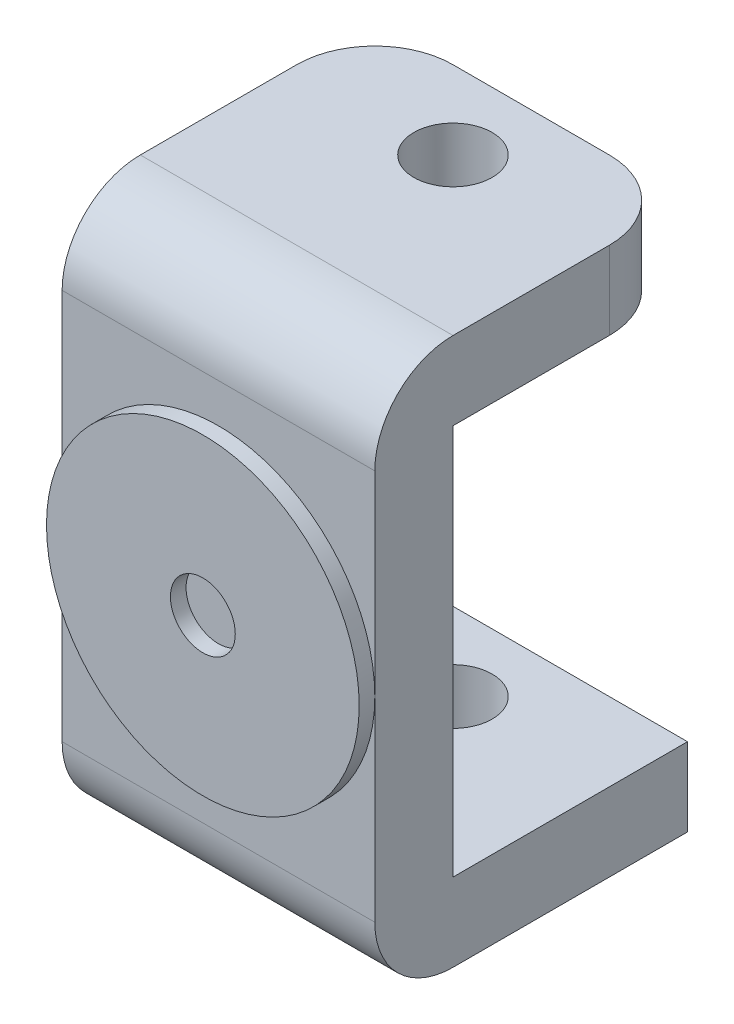
ISO-10303-21;
HEADER;
FILE_DESCRIPTION(('STEP AP214'),'2;1');
FILE_NAME('part.step','',(''),(''),'','','');
FILE_SCHEMA(('AUTOMOTIVE_DESIGN { 1 0 10303 214 1 1 1 1 }'));
ENDSEC;
DATA;
#1=APPLICATION_CONTEXT('core data for automotive mechanical design processes');
#2=APPLICATION_PROTOCOL_DEFINITION('international standard','automotive_design',2000,#1);
#3=PRODUCT_CONTEXT('',#1,'mechanical');
#4=PRODUCT('Part','Part','',(#3));
#5=PRODUCT_RELATED_PRODUCT_CATEGORY('part','',(#4));
#6=PRODUCT_DEFINITION_FORMATION('','',#4);
#7=PRODUCT_DEFINITION_CONTEXT('part definition',#1,'design');
#8=PRODUCT_DEFINITION('design','',#6,#7);
#9=PRODUCT_DEFINITION_SHAPE('','',#8);
#10=(LENGTH_UNIT() NAMED_UNIT(*) SI_UNIT(.MILLI.,.METRE.));
#11=(NAMED_UNIT(*) PLANE_ANGLE_UNIT() SI_UNIT($,.RADIAN.));
#12=(NAMED_UNIT(*) SI_UNIT($,.STERADIAN.) SOLID_ANGLE_UNIT());
#13=UNCERTAINTY_MEASURE_WITH_UNIT(LENGTH_MEASURE(1.E-05),#10,'distance_accuracy_value','');
#14=(GEOMETRIC_REPRESENTATION_CONTEXT(3) GLOBAL_UNCERTAINTY_ASSIGNED_CONTEXT((#13)) GLOBAL_UNIT_ASSIGNED_CONTEXT((#10,
#11,#12)) REPRESENTATION_CONTEXT('',''));
#15=CARTESIAN_POINT('',(0.,0.,0.));
#16=DIRECTION('',(0.,0.,1.));
#17=DIRECTION('',(1.,0.,0.));
#18=AXIS2_PLACEMENT_3D('',#15,#16,#17);
#19=CARTESIAN_POINT('',(0.,0.,1.));
#20=DIRECTION('',(0.,0.,1.));
#21=DIRECTION('',(1.,0.,0.));
#22=AXIS2_PLACEMENT_3D('',#19,#20,#21);
#23=PLANE('',#22);
#24=DIRECTION('',(0.,1.,0.));
#25=VECTOR('',#24,1.);
#26=CARTESIAN_POINT('',(2.,2.5,1.));
#27=LINE('',#26,#25);
#28=CARTESIAN_POINT('',(2.,-2.5,1.));
#29=VERTEX_POINT('',#28);
#30=CARTESIAN_POINT('',(2.,0.,1.));
#31=VERTEX_POINT('',#30);
#32=EDGE_CURVE('E147',#29,#31,#27,.T.);
#33=ORIENTED_EDGE('',*,*,#32,.T.);
#34=CARTESIAN_POINT('',(0.,0.,1.));
#35=DIRECTION('',(0.,0.,1.));
#36=DIRECTION('',(1.,0.,0.));
#37=AXIS2_PLACEMENT_3D('',#34,#35,#36);
#38=CIRCLE('',#37,2.);
#39=CARTESIAN_POINT('',(-2.,0.,1.));
#40=VERTEX_POINT('',#39);
#41=EDGE_CURVE('E11',#31,#40,#38,.F.);
#42=ORIENTED_EDGE('',*,*,#41,.T.);
#43=DIRECTION('',(0.,-1.,0.));
#44=VECTOR('',#43,1.);
#45=CARTESIAN_POINT('',(-2.,2.5,1.));
#46=LINE('',#45,#44);
#47=CARTESIAN_POINT('',(-2.,-2.5,1.));
#48=VERTEX_POINT('',#47);
#49=EDGE_CURVE('E144',#40,#48,#46,.T.);
#50=ORIENTED_EDGE('',*,*,#49,.T.);
#51=DIRECTION('',(-1.,0.,0.));
#52=VECTOR('',#51,1.);
#53=CARTESIAN_POINT('',(2.,-2.5,1.));
#54=LINE('',#53,#52);
#55=EDGE_CURVE('E196',#48,#29,#54,.F.);
#56=ORIENTED_EDGE('',*,*,#55,.T.);
#57=EDGE_LOOP('',(#33,#42,#50,#56));
#58=FACE_BOUND('',#57,.T.);
#59=ADVANCED_FACE('F39',(#58),#23,.T.);
#60=CARTESIAN_POINT('',(2.,2.5,1.));
#61=DIRECTION('',(-1.,0.,0.));
#62=DIRECTION('',(0.,-1.,0.));
#63=AXIS2_PLACEMENT_3D('',#60,#61,#62);
#64=PLANE('',#63);
#65=ORIENTED_EDGE('',*,*,#32,.F.);
#66=CARTESIAN_POINT('',(2.,-2.5,0.));
#67=DIRECTION('',(-1.,0.,0.));
#68=DIRECTION('',(0.,-1.,0.));
#69=AXIS2_PLACEMENT_3D('',#66,#67,#68);
#70=CIRCLE('',#69,1.);
#71=CARTESIAN_POINT('',(2.,-3.5,0.));
#72=VERTEX_POINT('',#71);
#73=EDGE_CURVE('E207',#29,#72,#70,.F.);
#74=ORIENTED_EDGE('',*,*,#73,.T.);
#75=DIRECTION('',(0.,0.,-1.));
#76=VECTOR('',#75,1.);
#77=CARTESIAN_POINT('',(2.,-3.5,0.999999999999999));
#78=LINE('',#77,#76);
#79=CARTESIAN_POINT('',(2.,-3.5,-3.));
#80=VERTEX_POINT('',#79);
#81=EDGE_CURVE('E336',#72,#80,#78,.T.);
#82=ORIENTED_EDGE('',*,*,#81,.T.);
#83=DIRECTION('',(0.,1.,0.));
#84=VECTOR('',#83,1.);
#85=CARTESIAN_POINT('',(2.,-2.5,-3.));
#86=LINE('',#85,#84);
#87=CARTESIAN_POINT('',(2.,-2.5,-3.));
#88=VERTEX_POINT('',#87);
#89=EDGE_CURVE('E326',#80,#88,#86,.T.);
#90=ORIENTED_EDGE('',*,*,#89,.T.);
#91=DIRECTION('',(0.,0.,1.));
#92=VECTOR('',#91,1.);
#93=CARTESIAN_POINT('',(2.,-2.5,0.999999999999999));
#94=LINE('',#93,#92);
#95=CARTESIAN_POINT('',(2.,-2.5,0.));
#96=VERTEX_POINT('',#95);
#97=EDGE_CURVE('E324',#88,#96,#94,.T.);
#98=ORIENTED_EDGE('',*,*,#97,.T.);
#99=DIRECTION('',(0.,1.,0.));
#100=VECTOR('',#99,1.);
#101=CARTESIAN_POINT('',(2.,2.5,0.));
#102=LINE('',#101,#100);
#103=CARTESIAN_POINT('',(2.,2.5,0.));
#104=VERTEX_POINT('',#103);
#105=EDGE_CURVE('E170',#96,#104,#102,.T.);
#106=ORIENTED_EDGE('',*,*,#105,.T.);
#107=DIRECTION('',(0.,0.,-1.));
#108=VECTOR('',#107,1.);
#109=CARTESIAN_POINT('',(2.,2.5,0.999999999999999));
#110=LINE('',#109,#108);
#111=CARTESIAN_POINT('',(2.,2.5,-2.));
#112=VERTEX_POINT('',#111);
#113=EDGE_CURVE('E291',#104,#112,#110,.T.);
#114=ORIENTED_EDGE('',*,*,#113,.T.);
#115=DIRECTION('',(0.,1.,0.));
#116=VECTOR('',#115,1.);
#117=CARTESIAN_POINT('',(2.,2.5,-2.));
#118=LINE('',#117,#116);
#119=CARTESIAN_POINT('',(2.,3.5,-2.));
#120=VERTEX_POINT('',#119);
#121=EDGE_CURVE('E199',#112,#120,#118,.T.);
#122=ORIENTED_EDGE('',*,*,#121,.T.);
#123=DIRECTION('',(0.,0.,1.));
#124=VECTOR('',#123,1.);
#125=CARTESIAN_POINT('',(2.,3.5,0.999999999999999));
#126=LINE('',#125,#124);
#127=CARTESIAN_POINT('',(2.,3.5,0.));
#128=VERTEX_POINT('',#127);
#129=EDGE_CURVE('E285',#120,#128,#126,.T.);
#130=ORIENTED_EDGE('',*,*,#129,.T.);
#131=CARTESIAN_POINT('',(2.,2.5,0.));
#132=DIRECTION('',(-1.,0.,0.));
#133=DIRECTION('',(0.,-1.,0.));
#134=AXIS2_PLACEMENT_3D('',#131,#132,#133);
#135=CIRCLE('',#134,1.);
#136=CARTESIAN_POINT('',(2.,2.5,1.));
#137=VERTEX_POINT('',#136);
#138=EDGE_CURVE('E203',#128,#137,#135,.F.);
#139=ORIENTED_EDGE('',*,*,#138,.T.);
#140=EDGE_CURVE('E185',#31,#137,#27,.T.);
#141=ORIENTED_EDGE('',*,*,#140,.F.);
#142=EDGE_LOOP('',(#65,#74,#82,#90,#98,#106,#114,#122,#130,#139,#141));
#143=FACE_BOUND('',#142,.T.);
#144=ADVANCED_FACE('F254',(#143),#64,.F.);
#145=CARTESIAN_POINT('',(-2.,2.5,1.));
#146=DIRECTION('',(1.,0.,0.));
#147=DIRECTION('',(0.,1.,0.));
#148=AXIS2_PLACEMENT_3D('',#145,#146,#147);
#149=PLANE('',#148);
#150=DIRECTION('',(0.,0.,-1.));
#151=VECTOR('',#150,1.);
#152=CARTESIAN_POINT('',(-2.,-3.5,0.999999999999999));
#153=LINE('',#152,#151);
#154=CARTESIAN_POINT('',(-2.,-3.5,0.));
#155=VERTEX_POINT('',#154);
#156=CARTESIAN_POINT('',(-2.,-3.5,-3.));
#157=VERTEX_POINT('',#156);
#158=EDGE_CURVE('E340',#155,#157,#153,.T.);
#159=ORIENTED_EDGE('',*,*,#158,.F.);
#160=CARTESIAN_POINT('',(-2.,-2.5,0.));
#161=DIRECTION('',(1.,0.,0.));
#162=DIRECTION('',(0.,1.,0.));
#163=AXIS2_PLACEMENT_3D('',#160,#161,#162);
#164=CIRCLE('',#163,1.);
#165=EDGE_CURVE('E153',#155,#48,#164,.F.);
#166=ORIENTED_EDGE('',*,*,#165,.T.);
#167=ORIENTED_EDGE('',*,*,#49,.F.);
#168=CARTESIAN_POINT('',(-2.,2.5,1.));
#169=VERTEX_POINT('',#168);
#170=EDGE_CURVE('E152',#169,#40,#46,.T.);
#171=ORIENTED_EDGE('',*,*,#170,.F.);
#172=CARTESIAN_POINT('',(-2.,2.5,0.));
#173=DIRECTION('',(1.,0.,0.));
#174=DIRECTION('',(0.,1.,0.));
#175=AXIS2_PLACEMENT_3D('',#172,#173,#174);
#176=CIRCLE('',#175,1.);
#177=CARTESIAN_POINT('',(-2.,3.5,0.));
#178=VERTEX_POINT('',#177);
#179=EDGE_CURVE('E165',#169,#178,#176,.F.);
#180=ORIENTED_EDGE('',*,*,#179,.T.);
#181=DIRECTION('',(0.,0.,1.));
#182=VECTOR('',#181,1.);
#183=CARTESIAN_POINT('',(-2.,3.5,0.999999999999999));
#184=LINE('',#183,#182);
#185=CARTESIAN_POINT('',(-2.,3.5,-2.));
#186=VERTEX_POINT('',#185);
#187=EDGE_CURVE('E297',#186,#178,#184,.T.);
#188=ORIENTED_EDGE('',*,*,#187,.F.);
#189=DIRECTION('',(0.,1.,0.));
#190=VECTOR('',#189,1.);
#191=CARTESIAN_POINT('',(-2.,2.5,-2.));
#192=LINE('',#191,#190);
#193=CARTESIAN_POINT('',(-2.,2.5,-2.));
#194=VERTEX_POINT('',#193);
#195=EDGE_CURVE('E189',#186,#194,#192,.F.);
#196=ORIENTED_EDGE('',*,*,#195,.T.);
#197=DIRECTION('',(0.,0.,-1.));
#198=VECTOR('',#197,1.);
#199=CARTESIAN_POINT('',(-2.,2.5,0.999999999999999));
#200=LINE('',#199,#198);
#201=CARTESIAN_POINT('',(-2.,2.5,0.));
#202=VERTEX_POINT('',#201);
#203=EDGE_CURVE('E301',#202,#194,#200,.T.);
#204=ORIENTED_EDGE('',*,*,#203,.F.);
#205=DIRECTION('',(0.,-1.,0.));
#206=VECTOR('',#205,1.);
#207=CARTESIAN_POINT('',(-2.,2.5,0.));
#208=LINE('',#207,#206);
#209=CARTESIAN_POINT('',(-2.,-2.5,0.));
#210=VERTEX_POINT('',#209);
#211=EDGE_CURVE('E179',#202,#210,#208,.T.);
#212=ORIENTED_EDGE('',*,*,#211,.T.);
#213=DIRECTION('',(0.,0.,1.));
#214=VECTOR('',#213,1.);
#215=CARTESIAN_POINT('',(-2.,-2.5,0.999999999999999));
#216=LINE('',#215,#214);
#217=CARTESIAN_POINT('',(-2.,-2.5,-3.));
#218=VERTEX_POINT('',#217);
#219=EDGE_CURVE('E346',#218,#210,#216,.T.);
#220=ORIENTED_EDGE('',*,*,#219,.F.);
#221=DIRECTION('',(0.,1.,0.));
#222=VECTOR('',#221,1.);
#223=CARTESIAN_POINT('',(-2.,-2.5,-3.));
#224=LINE('',#223,#222);
#225=EDGE_CURVE('E343',#157,#218,#224,.T.);
#226=ORIENTED_EDGE('',*,*,#225,.F.);
#227=EDGE_LOOP('',(#159,#166,#167,#171,#180,#188,#196,#204,#212,#220,#226));
#228=FACE_BOUND('',#227,.T.);
#229=ADVANCED_FACE('F151',(#228),#149,.F.);
#230=ORIENTED_EDGE('',*,*,#170,.T.);
#231=CARTESIAN_POINT('',(0.,0.,1.));
#232=DIRECTION('',(0.,0.,1.));
#233=DIRECTION('',(1.,0.,0.));
#234=AXIS2_PLACEMENT_3D('',#231,#232,#233);
#235=CIRCLE('',#234,2.);
#236=EDGE_CURVE('E132',#31,#40,#235,.T.);
#237=ORIENTED_EDGE('',*,*,#236,.F.);
#238=ORIENTED_EDGE('',*,*,#140,.T.);
#239=DIRECTION('',(-1.,0.,0.));
#240=VECTOR('',#239,1.);
#241=CARTESIAN_POINT('',(-2.,2.5,1.));
#242=LINE('',#241,#240);
#243=EDGE_CURVE('E160',#137,#169,#242,.T.);
#244=ORIENTED_EDGE('',*,*,#243,.T.);
#245=EDGE_LOOP('',(#230,#237,#238,#244));
#246=FACE_BOUND('',#245,.T.);
#247=ADVANCED_FACE('F158',(#246),#23,.T.);
#248=CARTESIAN_POINT('',(0.,0.,0.));
#249=DIRECTION('',(0.,0.,1.));
#250=DIRECTION('',(1.,0.,0.));
#251=AXIS2_PLACEMENT_3D('',#248,#249,#250);
#252=PLANE('',#251);
#253=ORIENTED_EDGE('',*,*,#105,.F.);
#254=DIRECTION('',(1.,0.,0.));
#255=VECTOR('',#254,1.);
#256=CARTESIAN_POINT('',(-2.,-2.5,0.));
#257=LINE('',#256,#255);
#258=EDGE_CURVE('E182',#210,#96,#257,.T.);
#259=ORIENTED_EDGE('',*,*,#258,.F.);
#260=ORIENTED_EDGE('',*,*,#211,.F.);
#261=DIRECTION('',(-1.,0.,0.));
#262=VECTOR('',#261,1.);
#263=CARTESIAN_POINT('',(-2.,2.5,0.));
#264=LINE('',#263,#262);
#265=EDGE_CURVE('E174',#104,#202,#264,.T.);
#266=ORIENTED_EDGE('',*,*,#265,.F.);
#267=EDGE_LOOP('',(#253,#259,#260,#266));
#268=FACE_BOUND('',#267,.T.);
#269=ADVANCED_FACE('F252',(#268),#252,.F.);
#270=CARTESIAN_POINT('',(2.,2.5,0.999999999999999));
#271=DIRECTION('',(0.,1.,0.));
#272=DIRECTION('',(0.,0.,1.));
#273=AXIS2_PLACEMENT_3D('',#270,#271,#272);
#274=PLANE('',#273);
#275=CARTESIAN_POINT('',(0.,2.5,-2.));
#276=DIRECTION('',(0.,1.,0.));
#277=DIRECTION('',(0.,0.,1.));
#278=AXIS2_PLACEMENT_3D('',#275,#276,#277);
#279=CIRCLE('',#278,0.5);
#280=CARTESIAN_POINT('',(0.,2.5,-1.5));
#281=VERTEX_POINT('',#280);
#282=EDGE_CURVE('E384',#281,#281,#279,.T.);
#283=ORIENTED_EDGE('',*,*,#282,.T.);
#284=EDGE_LOOP('',(#283));
#285=FACE_BOUND('',#284,.T.);
#286=ORIENTED_EDGE('',*,*,#203,.T.);
#287=CARTESIAN_POINT('',(-0.999999999999998,2.5,-2.));
#288=DIRECTION('',(0.,1.,0.));
#289=DIRECTION('',(0.,0.,1.));
#290=AXIS2_PLACEMENT_3D('',#287,#288,#289);
#291=CIRCLE('',#290,1.);
#292=CARTESIAN_POINT('',(-0.999999999999998,2.5,-3.));
#293=VERTEX_POINT('',#292);
#294=EDGE_CURVE('E60',#194,#293,#291,.F.);
#295=ORIENTED_EDGE('',*,*,#294,.T.);
#296=DIRECTION('',(-1.,0.,0.));
#297=VECTOR('',#296,1.);
#298=CARTESIAN_POINT('',(2.,2.5,-3.));
#299=LINE('',#298,#297);
#300=CARTESIAN_POINT('',(1.,2.5,-3.));
#301=VERTEX_POINT('',#300);
#302=EDGE_CURVE('E175',#301,#293,#299,.T.);
#303=ORIENTED_EDGE('',*,*,#302,.F.);
#304=CARTESIAN_POINT('',(1.,2.5,-2.));
#305=DIRECTION('',(0.,1.,0.));
#306=DIRECTION('',(0.,0.,1.));
#307=AXIS2_PLACEMENT_3D('',#304,#305,#306);
#308=CIRCLE('',#307,1.);
#309=EDGE_CURVE('E226',#301,#112,#308,.F.);
#310=ORIENTED_EDGE('',*,*,#309,.T.);
#311=ORIENTED_EDGE('',*,*,#113,.F.);
#312=ORIENTED_EDGE('',*,*,#265,.T.);
#313=EDGE_LOOP('',(#286,#295,#303,#310,#311,#312));
#314=FACE_BOUND('',#313,.T.);
#315=ADVANCED_FACE('F318',(#285,#314),#274,.F.);
#316=CARTESIAN_POINT('',(2.,2.5,-3.));
#317=DIRECTION('',(0.,0.,1.));
#318=DIRECTION('',(1.,0.,0.));
#319=AXIS2_PLACEMENT_3D('',#316,#317,#318);
#320=PLANE('',#319);
#321=ORIENTED_EDGE('',*,*,#302,.T.);
#322=DIRECTION('',(0.,1.,0.));
#323=VECTOR('',#322,1.);
#324=CARTESIAN_POINT('',(-0.999999999999998,2.5,-3.));
#325=LINE('',#324,#323);
#326=CARTESIAN_POINT('',(-0.999999999999998,3.5,-3.));
#327=VERTEX_POINT('',#326);
#328=EDGE_CURVE('E213',#293,#327,#325,.T.);
#329=ORIENTED_EDGE('',*,*,#328,.T.);
#330=DIRECTION('',(-1.,0.,0.));
#331=VECTOR('',#330,1.);
#332=CARTESIAN_POINT('',(2.,3.5,-3.));
#333=LINE('',#332,#331);
#334=CARTESIAN_POINT('',(1.,3.5,-3.));
#335=VERTEX_POINT('',#334);
#336=EDGE_CURVE('E290',#335,#327,#333,.T.);
#337=ORIENTED_EDGE('',*,*,#336,.F.);
#338=DIRECTION('',(0.,1.,0.));
#339=VECTOR('',#338,1.);
#340=CARTESIAN_POINT('',(1.,2.5,-3.));
#341=LINE('',#340,#339);
#342=EDGE_CURVE('E210',#335,#301,#341,.F.);
#343=ORIENTED_EDGE('',*,*,#342,.T.);
#344=EDGE_LOOP('',(#321,#329,#337,#343));
#345=FACE_BOUND('',#344,.T.);
#346=ADVANCED_FACE('F310',(#345),#320,.F.);
#347=CARTESIAN_POINT('',(2.,3.5,0.999999999999999));
#348=DIRECTION('',(0.,-1.,0.));
#349=DIRECTION('',(0.,0.,-1.));
#350=AXIS2_PLACEMENT_3D('',#347,#348,#349);
#351=PLANE('',#350);
#352=CARTESIAN_POINT('',(0.,3.5,-2.));
#353=DIRECTION('',(0.,-1.,0.));
#354=DIRECTION('',(0.,0.,-1.));
#355=AXIS2_PLACEMENT_3D('',#352,#353,#354);
#356=CIRCLE('',#355,0.5);
#357=CARTESIAN_POINT('',(0.,3.5,-2.5));
#358=VERTEX_POINT('',#357);
#359=EDGE_CURVE('E393',#358,#358,#356,.T.);
#360=ORIENTED_EDGE('',*,*,#359,.T.);
#361=EDGE_LOOP('',(#360));
#362=FACE_BOUND('',#361,.T.);
#363=ORIENTED_EDGE('',*,*,#336,.T.);
#364=CARTESIAN_POINT('',(-0.999999999999998,3.5,-2.));
#365=DIRECTION('',(0.,-1.,0.));
#366=DIRECTION('',(0.,0.,-1.));
#367=AXIS2_PLACEMENT_3D('',#364,#365,#366);
#368=CIRCLE('',#367,1.);
#369=EDGE_CURVE('E223',#327,#186,#368,.F.);
#370=ORIENTED_EDGE('',*,*,#369,.T.);
#371=ORIENTED_EDGE('',*,*,#187,.T.);
#372=DIRECTION('',(-1.,0.,0.));
#373=VECTOR('',#372,1.);
#374=CARTESIAN_POINT('',(2.,3.5,0.));
#375=LINE('',#374,#373);
#376=EDGE_CURVE('E220',#178,#128,#375,.F.);
#377=ORIENTED_EDGE('',*,*,#376,.T.);
#378=ORIENTED_EDGE('',*,*,#129,.F.);
#379=CARTESIAN_POINT('',(1.,3.5,-2.));
#380=DIRECTION('',(0.,-1.,0.));
#381=DIRECTION('',(0.,0.,-1.));
#382=AXIS2_PLACEMENT_3D('',#379,#380,#381);
#383=CIRCLE('',#382,1.);
#384=EDGE_CURVE('E217',#120,#335,#383,.F.);
#385=ORIENTED_EDGE('',*,*,#384,.T.);
#386=EDGE_LOOP('',(#363,#370,#371,#377,#378,#385));
#387=FACE_BOUND('',#386,.T.);
#388=ADVANCED_FACE('F316',(#362,#387),#351,.F.);
#389=CARTESIAN_POINT('',(2.,-2.5,0.999999999999999));
#390=DIRECTION('',(0.,-1.,0.));
#391=DIRECTION('',(0.,0.,-1.));
#392=AXIS2_PLACEMENT_3D('',#389,#390,#391);
#393=PLANE('',#392);
#394=CARTESIAN_POINT('',(0.,-2.5,-2.));
#395=DIRECTION('',(0.,-1.,0.));
#396=DIRECTION('',(0.,0.,-1.));
#397=AXIS2_PLACEMENT_3D('',#394,#395,#396);
#398=CIRCLE('',#397,0.5);
#399=CARTESIAN_POINT('',(0.,-2.5,-2.5));
#400=VERTEX_POINT('',#399);
#401=EDGE_CURVE('E387',#400,#400,#398,.T.);
#402=ORIENTED_EDGE('',*,*,#401,.T.);
#403=EDGE_LOOP('',(#402));
#404=FACE_BOUND('',#403,.T.);
#405=ORIENTED_EDGE('',*,*,#219,.T.);
#406=ORIENTED_EDGE('',*,*,#258,.T.);
#407=ORIENTED_EDGE('',*,*,#97,.F.);
#408=DIRECTION('',(-1.,0.,0.));
#409=VECTOR('',#408,1.);
#410=CARTESIAN_POINT('',(2.,-2.5,-3.));
#411=LINE('',#410,#409);
#412=EDGE_CURVE('E331',#88,#218,#411,.T.);
#413=ORIENTED_EDGE('',*,*,#412,.T.);
#414=EDGE_LOOP('',(#405,#406,#407,#413));
#415=FACE_BOUND('',#414,.T.);
#416=ADVANCED_FACE('F357',(#404,#415),#393,.F.);
#417=CARTESIAN_POINT('',(2.,-3.5,0.999999999999999));
#418=DIRECTION('',(0.,1.,0.));
#419=DIRECTION('',(0.,0.,1.));
#420=AXIS2_PLACEMENT_3D('',#417,#418,#419);
#421=PLANE('',#420);
#422=CARTESIAN_POINT('',(0.,-3.5,-2.));
#423=DIRECTION('',(0.,-1.,0.));
#424=DIRECTION('',(0.,0.,-1.));
#425=AXIS2_PLACEMENT_3D('',#422,#423,#424);
#426=CIRCLE('',#425,0.5);
#427=CARTESIAN_POINT('',(0.,-3.5,-2.5));
#428=VERTEX_POINT('',#427);
#429=EDGE_CURVE('E421',#428,#428,#426,.T.);
#430=ORIENTED_EDGE('',*,*,#429,.F.);
#431=EDGE_LOOP('',(#430));
#432=FACE_BOUND('',#431,.T.);
#433=ORIENTED_EDGE('',*,*,#81,.F.);
#434=DIRECTION('',(-1.,0.,0.));
#435=VECTOR('',#434,1.);
#436=CARTESIAN_POINT('',(-2.,-3.5,0.));
#437=LINE('',#436,#435);
#438=EDGE_CURVE('E162',#72,#155,#437,.T.);
#439=ORIENTED_EDGE('',*,*,#438,.T.);
#440=ORIENTED_EDGE('',*,*,#158,.T.);
#441=DIRECTION('',(-1.,0.,0.));
#442=VECTOR('',#441,1.);
#443=CARTESIAN_POINT('',(2.,-3.5,-3.));
#444=LINE('',#443,#442);
#445=EDGE_CURVE('E304',#80,#157,#444,.T.);
#446=ORIENTED_EDGE('',*,*,#445,.F.);
#447=EDGE_LOOP('',(#433,#439,#440,#446));
#448=FACE_BOUND('',#447,.T.);
#449=ADVANCED_FACE('F359',(#432,#448),#421,.F.);
#450=CARTESIAN_POINT('',(2.,-2.5,-3.));
#451=DIRECTION('',(0.,0.,1.));
#452=DIRECTION('',(1.,0.,0.));
#453=AXIS2_PLACEMENT_3D('',#450,#451,#452);
#454=PLANE('',#453);
#455=ORIENTED_EDGE('',*,*,#225,.T.);
#456=ORIENTED_EDGE('',*,*,#412,.F.);
#457=ORIENTED_EDGE('',*,*,#89,.F.);
#458=ORIENTED_EDGE('',*,*,#445,.T.);
#459=EDGE_LOOP('',(#455,#456,#457,#458));
#460=FACE_BOUND('',#459,.T.);
#461=ADVANCED_FACE('F269',(#460),#454,.F.);
#462=CARTESIAN_POINT('',(2.,-2.5,0.));
#463=DIRECTION('',(1.,0.,0.));
#464=DIRECTION('',(0.,0.,-1.));
#465=AXIS2_PLACEMENT_3D('',#462,#463,#464);
#466=CYLINDRICAL_SURFACE('',#465,1.);
#467=ORIENTED_EDGE('',*,*,#73,.F.);
#468=ORIENTED_EDGE('',*,*,#55,.F.);
#469=ORIENTED_EDGE('',*,*,#165,.F.);
#470=ORIENTED_EDGE('',*,*,#438,.F.);
#471=EDGE_LOOP('',(#467,#468,#469,#470));
#472=FACE_BOUND('',#471,.T.);
#473=ADVANCED_FACE('F265',(#472),#466,.T.);
#474=CARTESIAN_POINT('',(-0.999999999999998,2.5,-2.));
#475=DIRECTION('',(0.,1.,0.));
#476=DIRECTION('',(-1.,0.,0.));
#477=AXIS2_PLACEMENT_3D('',#474,#475,#476);
#478=CYLINDRICAL_SURFACE('',#477,1.);
#479=ORIENTED_EDGE('',*,*,#294,.F.);
#480=ORIENTED_EDGE('',*,*,#195,.F.);
#481=ORIENTED_EDGE('',*,*,#369,.F.);
#482=ORIENTED_EDGE('',*,*,#328,.F.);
#483=EDGE_LOOP('',(#479,#480,#481,#482));
#484=FACE_BOUND('',#483,.T.);
#485=ADVANCED_FACE('F268',(#484),#478,.T.);
#486=CARTESIAN_POINT('',(0.,2.5,0.));
#487=DIRECTION('',(1.,0.,0.));
#488=DIRECTION('',(0.,0.,-1.));
#489=AXIS2_PLACEMENT_3D('',#486,#487,#488);
#490=CYLINDRICAL_SURFACE('',#489,1.);
#491=ORIENTED_EDGE('',*,*,#138,.F.);
#492=ORIENTED_EDGE('',*,*,#376,.F.);
#493=ORIENTED_EDGE('',*,*,#179,.F.);
#494=ORIENTED_EDGE('',*,*,#243,.F.);
#495=EDGE_LOOP('',(#491,#492,#493,#494));
#496=FACE_BOUND('',#495,.T.);
#497=ADVANCED_FACE('F272',(#496),#490,.T.);
#498=CARTESIAN_POINT('',(1.,2.5,-2.));
#499=DIRECTION('',(0.,1.,0.));
#500=DIRECTION('',(-1.,0.,0.));
#501=AXIS2_PLACEMENT_3D('',#498,#499,#500);
#502=CYLINDRICAL_SURFACE('',#501,1.);
#503=ORIENTED_EDGE('',*,*,#309,.F.);
#504=ORIENTED_EDGE('',*,*,#342,.F.);
#505=ORIENTED_EDGE('',*,*,#384,.F.);
#506=ORIENTED_EDGE('',*,*,#121,.F.);
#507=EDGE_LOOP('',(#503,#504,#505,#506));
#508=FACE_BOUND('',#507,.T.);
#509=ADVANCED_FACE('F41',(#508),#502,.T.);
#510=CARTESIAN_POINT('',(0.,0.,1.2));
#511=DIRECTION('',(0.,0.,1.));
#512=DIRECTION('',(1.,0.,0.));
#513=AXIS2_PLACEMENT_3D('',#510,#511,#512);
#514=PLANE('',#513);
#515=CARTESIAN_POINT('',(0.,0.,1.2));
#516=DIRECTION('',(0.,0.,1.));
#517=DIRECTION('',(1.,0.,0.));
#518=AXIS2_PLACEMENT_3D('',#515,#516,#517);
#519=CIRCLE('',#518,2.);
#520=CARTESIAN_POINT('',(2.,0.,1.2));
#521=VERTEX_POINT('',#520);
#522=EDGE_CURVE('E138',#521,#521,#519,.T.);
#523=ORIENTED_EDGE('',*,*,#522,.T.);
#524=EDGE_LOOP('',(#523));
#525=FACE_BOUND('',#524,.T.);
#526=CARTESIAN_POINT('',(0.,0.,1.2));
#527=DIRECTION('',(0.,0.,1.));
#528=DIRECTION('',(1.,0.,0.));
#529=AXIS2_PLACEMENT_3D('',#526,#527,#528);
#530=CIRCLE('',#529,0.415);
#531=CARTESIAN_POINT('',(0.415,0.,1.2));
#532=VERTEX_POINT('',#531);
#533=EDGE_CURVE('E139',#532,#532,#530,.T.);
#534=ORIENTED_EDGE('',*,*,#533,.F.);
#535=EDGE_LOOP('',(#534));
#536=FACE_BOUND('',#535,.T.);
#537=ADVANCED_FACE('F279',(#525,#536),#514,.T.);
#538=CARTESIAN_POINT('',(0.,0.,1.2));
#539=DIRECTION('',(0.,0.,-1.));
#540=DIRECTION('',(-1.,0.,0.));
#541=AXIS2_PLACEMENT_3D('',#538,#539,#540);
#542=CYLINDRICAL_SURFACE('',#541,2.);
#543=ORIENTED_EDGE('',*,*,#522,.F.);
#544=EDGE_LOOP('',(#543));
#545=FACE_BOUND('',#544,.T.);
#546=ORIENTED_EDGE('',*,*,#236,.T.);
#547=ORIENTED_EDGE('',*,*,#41,.F.);
#548=EDGE_LOOP('',(#546,#547));
#549=FACE_BOUND('',#548,.T.);
#550=ADVANCED_FACE('F133',(#545,#549),#542,.T.);
#551=CARTESIAN_POINT('',(0.,0.,1.2));
#552=DIRECTION('',(0.,0.,-1.));
#553=DIRECTION('',(-1.,0.,0.));
#554=AXIS2_PLACEMENT_3D('',#551,#552,#553);
#555=CYLINDRICAL_SURFACE('',#554,0.415);
#556=ORIENTED_EDGE('',*,*,#533,.T.);
#557=EDGE_LOOP('',(#556));
#558=FACE_BOUND('',#557,.T.);
#559=CARTESIAN_POINT('',(0.,0.,1.));
#560=DIRECTION('',(0.,0.,1.));
#561=DIRECTION('',(1.,0.,0.));
#562=AXIS2_PLACEMENT_3D('',#559,#560,#561);
#563=CIRCLE('',#562,0.415);
#564=CARTESIAN_POINT('',(0.415,0.,1.));
#565=VERTEX_POINT('',#564);
#566=EDGE_CURVE('E48',#565,#565,#563,.F.);
#567=ORIENTED_EDGE('',*,*,#566,.T.);
#568=EDGE_LOOP('',(#567));
#569=FACE_BOUND('',#568,.T.);
#570=ADVANCED_FACE('F234',(#558,#569),#555,.F.);
#571=ORIENTED_EDGE('',*,*,#566,.F.);
#572=EDGE_LOOP('',(#571));
#573=FACE_BOUND('',#572,.T.);
#574=ADVANCED_FACE('F236',(#573),#23,.T.);
#575=CARTESIAN_POINT('',(0.,3.5,-2.));
#576=DIRECTION('',(0.,-1.,0.));
#577=DIRECTION('',(0.,0.,-1.));
#578=AXIS2_PLACEMENT_3D('',#575,#576,#577);
#579=CYLINDRICAL_SURFACE('',#578,0.5);
#580=ORIENTED_EDGE('',*,*,#429,.T.);
#581=EDGE_LOOP('',(#580));
#582=FACE_BOUND('',#581,.T.);
#583=ORIENTED_EDGE('',*,*,#401,.F.);
#584=EDGE_LOOP('',(#583));
#585=FACE_BOUND('',#584,.T.);
#586=ADVANCED_FACE('F238',(#582,#585),#579,.F.);
#587=ORIENTED_EDGE('',*,*,#359,.F.);
#588=EDGE_LOOP('',(#587));
#589=FACE_BOUND('',#588,.T.);
#590=ORIENTED_EDGE('',*,*,#282,.F.);
#591=EDGE_LOOP('',(#590));
#592=FACE_BOUND('',#591,.T.);
#593=ADVANCED_FACE('F244',(#589,#592),#579,.F.);
#594=CLOSED_SHELL('',(#59,#144,#229,#247,#269,#315,#346,#388,#416,#449,#461,#473,#485,#497,#509,
#537,#550,#570,#574,#586,#593));
#595=MANIFOLD_SOLID_BREP('B2',#594);
#596=ADVANCED_BREP_SHAPE_REPRESENTATION('',(#18,#595),#14);
#597=SHAPE_DEFINITION_REPRESENTATION(#9,#596);
ENDSEC;
END-ISO-10303-21;
